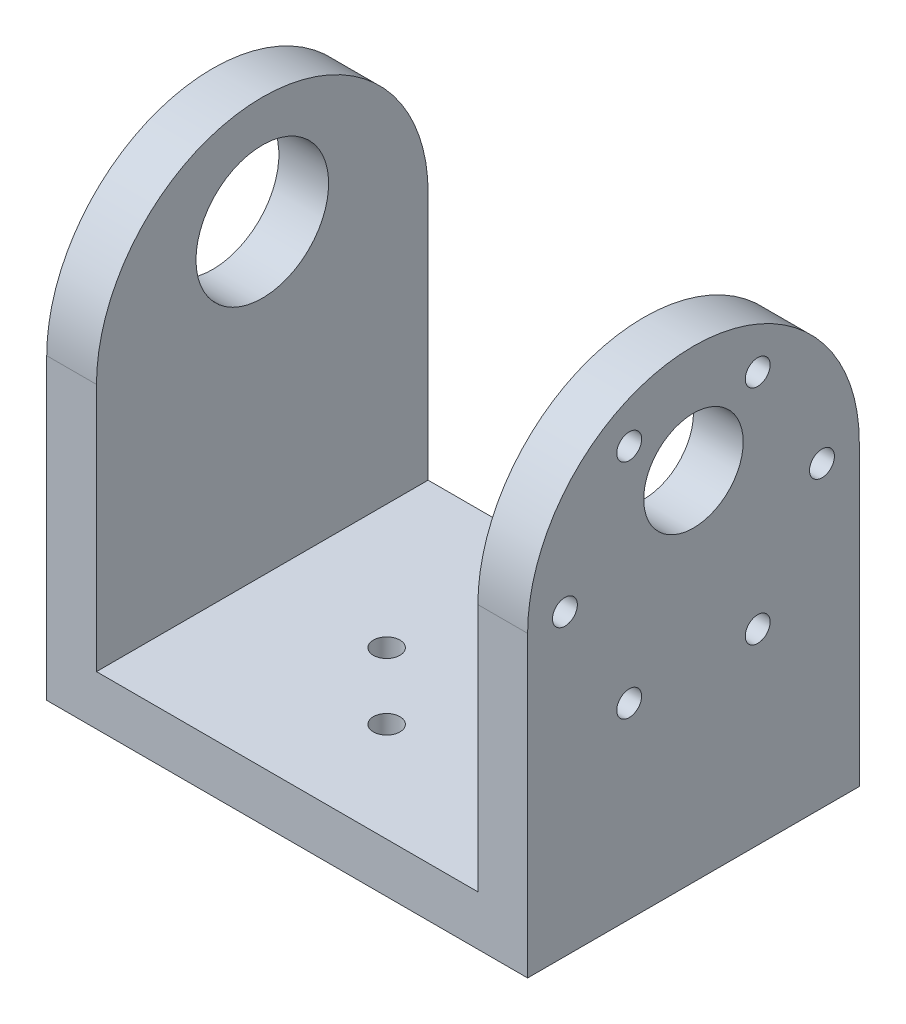
ISO-10303-21;
HEADER;
FILE_DESCRIPTION(('STEP AP214'),'2;1');
FILE_NAME('part.step','',(''),(''),'','','');
FILE_SCHEMA(('AUTOMOTIVE_DESIGN { 1 0 10303 214 1 1 1 1 }'));
ENDSEC;
DATA;
#1=APPLICATION_CONTEXT('core data for automotive mechanical design processes');
#2=APPLICATION_PROTOCOL_DEFINITION('international standard','automotive_design',2000,#1);
#3=PRODUCT_CONTEXT('',#1,'mechanical');
#4=PRODUCT('Part','Part','',(#3));
#5=PRODUCT_RELATED_PRODUCT_CATEGORY('part','',(#4));
#6=PRODUCT_DEFINITION_FORMATION('','',#4);
#7=PRODUCT_DEFINITION_CONTEXT('part definition',#1,'design');
#8=PRODUCT_DEFINITION('design','',#6,#7);
#9=PRODUCT_DEFINITION_SHAPE('','',#8);
#10=(LENGTH_UNIT() NAMED_UNIT(*) SI_UNIT(.MILLI.,.METRE.));
#11=(NAMED_UNIT(*) PLANE_ANGLE_UNIT() SI_UNIT($,.RADIAN.));
#12=(NAMED_UNIT(*) SI_UNIT($,.STERADIAN.) SOLID_ANGLE_UNIT());
#13=UNCERTAINTY_MEASURE_WITH_UNIT(LENGTH_MEASURE(1.E-05),#10,'distance_accuracy_value','');
#14=(GEOMETRIC_REPRESENTATION_CONTEXT(3) GLOBAL_UNCERTAINTY_ASSIGNED_CONTEXT((#13)) GLOBAL_UNIT_ASSIGNED_CONTEXT((#10,
#11,#12)) REPRESENTATION_CONTEXT('',''));
#15=CARTESIAN_POINT('',(0.,0.,0.));
#16=DIRECTION('',(0.,0.,1.));
#17=DIRECTION('',(1.,0.,0.));
#18=AXIS2_PLACEMENT_3D('',#15,#16,#17);
#19=CARTESIAN_POINT('',(0.,2.,0.));
#20=DIRECTION('',(0.,1.,0.));
#21=DIRECTION('',(0.,0.,1.));
#22=AXIS2_PLACEMENT_3D('',#19,#20,#21);
#23=PLANE('',#22);
#24=CARTESIAN_POINT('',(11.5,2.,-11.1985294117647));
#25=DIRECTION('',(0.,1.,0.));
#26=DIRECTION('',(0.,0.,1.));
#27=AXIS2_PLACEMENT_3D('',#24,#25,#26);
#28=CIRCLE('',#27,1.6);
#29=CARTESIAN_POINT('',(11.5,2.,-9.59852941176471));
#30=VERTEX_POINT('',#29);
#31=EDGE_CURVE('E336',#30,#30,#28,.T.);
#32=ORIENTED_EDGE('',*,*,#31,.F.);
#33=EDGE_LOOP('',(#32));
#34=FACE_BOUND('',#33,.T.);
#35=CARTESIAN_POINT('',(3.50000000000008,2.,-3.19852941176471));
#36=DIRECTION('',(0.,1.,0.));
#37=DIRECTION('',(0.,0.,1.));
#38=AXIS2_PLACEMENT_3D('',#35,#36,#37);
#39=CIRCLE('',#38,1.6);
#40=CARTESIAN_POINT('',(3.50000000000008,2.,-1.59852941176471));
#41=VERTEX_POINT('',#40);
#42=EDGE_CURVE('E343',#41,#41,#39,.T.);
#43=ORIENTED_EDGE('',*,*,#42,.F.);
#44=EDGE_LOOP('',(#43));
#45=FACE_BOUND('',#44,.T.);
#46=CARTESIAN_POINT('',(-4.50000000000001,2.,-11.1985294117647));
#47=DIRECTION('',(0.,1.,0.));
#48=DIRECTION('',(0.,0.,1.));
#49=AXIS2_PLACEMENT_3D('',#46,#47,#48);
#50=CIRCLE('',#49,1.6);
#51=CARTESIAN_POINT('',(-4.50000000000001,2.,-9.59852941176465));
#52=VERTEX_POINT('',#51);
#53=EDGE_CURVE('E347',#52,#52,#50,.T.);
#54=ORIENTED_EDGE('',*,*,#53,.F.);
#55=EDGE_LOOP('',(#54));
#56=FACE_BOUND('',#55,.T.);
#57=CARTESIAN_POINT('',(3.49999999999997,2.,-19.1985294117647));
#58=DIRECTION('',(0.,1.,0.));
#59=DIRECTION('',(0.,0.,1.));
#60=AXIS2_PLACEMENT_3D('',#57,#58,#59);
#61=CIRCLE('',#60,1.6);
#62=CARTESIAN_POINT('',(3.49999999999997,2.,-17.5985294117647));
#63=VERTEX_POINT('',#62);
#64=EDGE_CURVE('E351',#63,#63,#61,.T.);
#65=ORIENTED_EDGE('',*,*,#64,.F.);
#66=EDGE_LOOP('',(#65));
#67=FACE_BOUND('',#66,.T.);
#68=DIRECTION('',(1.,0.,0.));
#69=VECTOR('',#68,1.);
#70=CARTESIAN_POINT('',(-21.5,2.,8.80147058823529));
#71=LINE('',#70,#69);
#72=CARTESIAN_POINT('',(-19.5,2.,8.80147058823529));
#73=VERTEX_POINT('',#72);
#74=CARTESIAN_POINT('',(26.5,2.,8.80147058823529));
#75=VERTEX_POINT('',#74);
#76=EDGE_CURVE('E65',#73,#75,#71,.T.);
#77=ORIENTED_EDGE('',*,*,#76,.T.);
#78=DIRECTION('',(0.,0.,-1.));
#79=VECTOR('',#78,1.);
#80=CARTESIAN_POINT('',(26.5,2.,0.));
#81=LINE('',#80,#79);
#82=CARTESIAN_POINT('',(26.5,2.,-31.1985294117647));
#83=VERTEX_POINT('',#82);
#84=EDGE_CURVE('E69',#75,#83,#81,.T.);
#85=ORIENTED_EDGE('',*,*,#84,.T.);
#86=DIRECTION('',(-1.,0.,0.));
#87=VECTOR('',#86,1.);
#88=CARTESIAN_POINT('',(-21.5,2.,-31.1985294117647));
#89=LINE('',#88,#87);
#90=CARTESIAN_POINT('',(-19.5,2.,-31.1985294117647));
#91=VERTEX_POINT('',#90);
#92=EDGE_CURVE('E194',#83,#91,#89,.T.);
#93=ORIENTED_EDGE('',*,*,#92,.T.);
#94=DIRECTION('',(0.,0.,1.));
#95=VECTOR('',#94,1.);
#96=CARTESIAN_POINT('',(-19.5,2.,8.80147058823529));
#97=LINE('',#96,#95);
#98=EDGE_CURVE('E124',#91,#73,#97,.T.);
#99=ORIENTED_EDGE('',*,*,#98,.T.);
#100=EDGE_LOOP('',(#77,#85,#93,#99));
#101=FACE_BOUND('',#100,.T.);
#102=ADVANCED_FACE('F47',(#34,#45,#56,#67,#101),#23,.T.);
#103=CARTESIAN_POINT('',(-21.5,-4.,8.80147058823529));
#104=DIRECTION('',(0.,0.,1.));
#105=DIRECTION('',(1.,0.,0.));
#106=AXIS2_PLACEMENT_3D('',#103,#104,#105);
#107=PLANE('',#106);
#108=DIRECTION('',(1.,0.,0.));
#109=VECTOR('',#108,1.);
#110=CARTESIAN_POINT('',(-21.5,-4.,8.80147058823529));
#111=LINE('',#110,#109);
#112=CARTESIAN_POINT('',(-25.5,-4.,8.80147058823529));
#113=VERTEX_POINT('',#112);
#114=CARTESIAN_POINT('',(32.5,-4.,8.80147058823529));
#115=VERTEX_POINT('',#114);
#116=EDGE_CURVE('E11',#113,#115,#111,.T.);
#117=ORIENTED_EDGE('',*,*,#116,.T.);
#118=DIRECTION('',(0.,-1.,0.));
#119=VECTOR('',#118,1.);
#120=CARTESIAN_POINT('',(32.5,-4.,8.80147058823529));
#121=LINE('',#120,#119);
#122=CARTESIAN_POINT('',(32.5,32.,8.80147058823529));
#123=VERTEX_POINT('',#122);
#124=EDGE_CURVE('E144',#123,#115,#121,.T.);
#125=ORIENTED_EDGE('',*,*,#124,.F.);
#126=DIRECTION('',(-1.,0.,0.));
#127=VECTOR('',#126,1.);
#128=CARTESIAN_POINT('',(32.5,32.,8.80147058823529));
#129=LINE('',#128,#127);
#130=CARTESIAN_POINT('',(26.5,32.,8.80147058823529));
#131=VERTEX_POINT('',#130);
#132=EDGE_CURVE('E163',#123,#131,#129,.T.);
#133=ORIENTED_EDGE('',*,*,#132,.T.);
#134=DIRECTION('',(0.,-1.,0.));
#135=VECTOR('',#134,1.);
#136=CARTESIAN_POINT('',(26.5,-4.,8.80147058823529));
#137=LINE('',#136,#135);
#138=EDGE_CURVE('E278',#131,#75,#137,.T.);
#139=ORIENTED_EDGE('',*,*,#138,.T.);
#140=ORIENTED_EDGE('',*,*,#76,.F.);
#141=DIRECTION('',(0.,1.,0.));
#142=VECTOR('',#141,1.);
#143=CARTESIAN_POINT('',(-19.5,2.,8.80147058823529));
#144=LINE('',#143,#142);
#145=CARTESIAN_POINT('',(-19.5,32.,8.80147058823529));
#146=VERTEX_POINT('',#145);
#147=EDGE_CURVE('E172',#73,#146,#144,.T.);
#148=ORIENTED_EDGE('',*,*,#147,.T.);
#149=DIRECTION('',(1.,0.,0.));
#150=VECTOR('',#149,1.);
#151=CARTESIAN_POINT('',(-25.5,32.,8.80147058823529));
#152=LINE('',#151,#150);
#153=CARTESIAN_POINT('',(-25.5,32.,8.80147058823529));
#154=VERTEX_POINT('',#153);
#155=EDGE_CURVE('E120',#154,#146,#152,.T.);
#156=ORIENTED_EDGE('',*,*,#155,.F.);
#157=DIRECTION('',(0.,1.,0.));
#158=VECTOR('',#157,1.);
#159=CARTESIAN_POINT('',(-25.5,2.,8.80147058823529));
#160=LINE('',#159,#158);
#161=EDGE_CURVE('E113',#113,#154,#160,.T.);
#162=ORIENTED_EDGE('',*,*,#161,.F.);
#163=EDGE_LOOP('',(#117,#125,#133,#139,#140,#148,#156,#162));
#164=FACE_BOUND('',#163,.T.);
#165=ADVANCED_FACE('F115',(#164),#107,.T.);
#166=CARTESIAN_POINT('',(-21.5,-4.,-31.1985294117647));
#167=DIRECTION('',(0.,0.,-1.));
#168=DIRECTION('',(-1.,0.,0.));
#169=AXIS2_PLACEMENT_3D('',#166,#167,#168);
#170=PLANE('',#169);
#171=DIRECTION('',(0.,-1.,0.));
#172=VECTOR('',#171,1.);
#173=CARTESIAN_POINT('',(-19.5,2.,-31.1985294117647));
#174=LINE('',#173,#172);
#175=CARTESIAN_POINT('',(-19.5,32.,-31.1985294117647));
#176=VERTEX_POINT('',#175);
#177=EDGE_CURVE('E179',#176,#91,#174,.T.);
#178=ORIENTED_EDGE('',*,*,#177,.T.);
#179=ORIENTED_EDGE('',*,*,#92,.F.);
#180=DIRECTION('',(0.,1.,0.));
#181=VECTOR('',#180,1.);
#182=CARTESIAN_POINT('',(26.5,-4.,-31.1985294117647));
#183=LINE('',#182,#181);
#184=CARTESIAN_POINT('',(26.5,32.,-31.1985294117647));
#185=VERTEX_POINT('',#184);
#186=EDGE_CURVE('E155',#83,#185,#183,.T.);
#187=ORIENTED_EDGE('',*,*,#186,.T.);
#188=DIRECTION('',(-1.,0.,0.));
#189=VECTOR('',#188,1.);
#190=CARTESIAN_POINT('',(32.5,32.,-31.1985294117647));
#191=LINE('',#190,#189);
#192=CARTESIAN_POINT('',(32.5,32.,-31.1985294117647));
#193=VERTEX_POINT('',#192);
#194=EDGE_CURVE('E166',#193,#185,#191,.T.);
#195=ORIENTED_EDGE('',*,*,#194,.F.);
#196=DIRECTION('',(0.,1.,0.));
#197=VECTOR('',#196,1.);
#198=CARTESIAN_POINT('',(32.5,-4.,-31.1985294117647));
#199=LINE('',#198,#197);
#200=CARTESIAN_POINT('',(32.5,-4.,-31.1985294117647));
#201=VERTEX_POINT('',#200);
#202=EDGE_CURVE('E143',#201,#193,#199,.T.);
#203=ORIENTED_EDGE('',*,*,#202,.F.);
#204=DIRECTION('',(-1.,0.,0.));
#205=VECTOR('',#204,1.);
#206=CARTESIAN_POINT('',(-21.5,-4.,-31.1985294117647));
#207=LINE('',#206,#205);
#208=CARTESIAN_POINT('',(-25.5,-4.,-31.1985294117647));
#209=VERTEX_POINT('',#208);
#210=EDGE_CURVE('E57',#201,#209,#207,.T.);
#211=ORIENTED_EDGE('',*,*,#210,.T.);
#212=DIRECTION('',(0.,-1.,0.));
#213=VECTOR('',#212,1.);
#214=CARTESIAN_POINT('',(-25.5,2.,-31.1985294117647));
#215=LINE('',#214,#213);
#216=CARTESIAN_POINT('',(-25.5,32.,-31.1985294117647));
#217=VERTEX_POINT('',#216);
#218=EDGE_CURVE('E131',#217,#209,#215,.T.);
#219=ORIENTED_EDGE('',*,*,#218,.F.);
#220=DIRECTION('',(1.,0.,0.));
#221=VECTOR('',#220,1.);
#222=CARTESIAN_POINT('',(-25.5,32.,-31.1985294117647));
#223=LINE('',#222,#221);
#224=EDGE_CURVE('E189',#217,#176,#223,.T.);
#225=ORIENTED_EDGE('',*,*,#224,.T.);
#226=EDGE_LOOP('',(#178,#179,#187,#195,#203,#211,#219,#225));
#227=FACE_BOUND('',#226,.T.);
#228=ADVANCED_FACE('F49',(#227),#170,.T.);
#229=CARTESIAN_POINT('',(0.,-4.,0.));
#230=DIRECTION('',(0.,1.,0.));
#231=DIRECTION('',(0.,0.,1.));
#232=AXIS2_PLACEMENT_3D('',#229,#230,#231);
#233=PLANE('',#232);
#234=CARTESIAN_POINT('',(11.5,-4.,-11.1985294117647));
#235=DIRECTION('',(0.,-1.,0.));
#236=DIRECTION('',(0.,0.,-1.));
#237=AXIS2_PLACEMENT_3D('',#234,#235,#236);
#238=CIRCLE('',#237,1.6);
#239=CARTESIAN_POINT('',(11.5,-4.,-12.7985294117647));
#240=VERTEX_POINT('',#239);
#241=EDGE_CURVE('E355',#240,#240,#238,.T.);
#242=ORIENTED_EDGE('',*,*,#241,.F.);
#243=EDGE_LOOP('',(#242));
#244=FACE_BOUND('',#243,.T.);
#245=CARTESIAN_POINT('',(3.50000000000008,-4.,-3.19852941176471));
#246=DIRECTION('',(0.,-1.,0.));
#247=DIRECTION('',(0.,0.,-1.));
#248=AXIS2_PLACEMENT_3D('',#245,#246,#247);
#249=CIRCLE('',#248,1.6);
#250=CARTESIAN_POINT('',(3.50000000000008,-4.,-4.79852941176471));
#251=VERTEX_POINT('',#250);
#252=EDGE_CURVE('E364',#251,#251,#249,.T.);
#253=ORIENTED_EDGE('',*,*,#252,.F.);
#254=EDGE_LOOP('',(#253));
#255=FACE_BOUND('',#254,.T.);
#256=CARTESIAN_POINT('',(-4.50000000000001,-4.,-11.1985294117647));
#257=DIRECTION('',(0.,-1.,0.));
#258=DIRECTION('',(0.,0.,-1.));
#259=AXIS2_PLACEMENT_3D('',#256,#257,#258);
#260=CIRCLE('',#259,1.6);
#261=CARTESIAN_POINT('',(-4.50000000000001,-4.,-12.7985294117647));
#262=VERTEX_POINT('',#261);
#263=EDGE_CURVE('E360',#262,#262,#260,.T.);
#264=ORIENTED_EDGE('',*,*,#263,.F.);
#265=EDGE_LOOP('',(#264));
#266=FACE_BOUND('',#265,.T.);
#267=CARTESIAN_POINT('',(3.49999999999997,-4.,-19.1985294117647));
#268=DIRECTION('',(0.,-1.,0.));
#269=DIRECTION('',(0.,0.,-1.));
#270=AXIS2_PLACEMENT_3D('',#267,#268,#269);
#271=CIRCLE('',#270,1.6);
#272=CARTESIAN_POINT('',(3.49999999999997,-4.,-20.7985294117647));
#273=VERTEX_POINT('',#272);
#274=EDGE_CURVE('E356',#273,#273,#271,.T.);
#275=ORIENTED_EDGE('',*,*,#274,.F.);
#276=EDGE_LOOP('',(#275));
#277=FACE_BOUND('',#276,.T.);
#278=DIRECTION('',(0.,0.,-1.));
#279=VECTOR('',#278,1.);
#280=CARTESIAN_POINT('',(-25.5,-4.,0.));
#281=LINE('',#280,#279);
#282=EDGE_CURVE('E128',#113,#209,#281,.T.);
#283=ORIENTED_EDGE('',*,*,#282,.T.);
#284=ORIENTED_EDGE('',*,*,#210,.F.);
#285=DIRECTION('',(0.,0.,-1.));
#286=VECTOR('',#285,1.);
#287=CARTESIAN_POINT('',(32.5,-4.,8.80147058823529));
#288=LINE('',#287,#286);
#289=EDGE_CURVE('E138',#115,#201,#288,.T.);
#290=ORIENTED_EDGE('',*,*,#289,.F.);
#291=ORIENTED_EDGE('',*,*,#116,.F.);
#292=EDGE_LOOP('',(#283,#284,#290,#291));
#293=FACE_BOUND('',#292,.T.);
#294=ADVANCED_FACE('F136',(#244,#255,#266,#277,#293),#233,.F.);
#295=CARTESIAN_POINT('',(-25.5,32.,-11.1985294117647));
#296=DIRECTION('',(1.,0.,0.));
#297=DIRECTION('',(0.,0.,-1.));
#298=AXIS2_PLACEMENT_3D('',#295,#296,#297);
#299=CYLINDRICAL_SURFACE('',#298,20.);
#300=ORIENTED_EDGE('',*,*,#155,.T.);
#301=CARTESIAN_POINT('',(-19.5,32.,-11.1985294117647));
#302=DIRECTION('',(-1.,0.,0.));
#303=DIRECTION('',(0.,0.,1.));
#304=AXIS2_PLACEMENT_3D('',#301,#302,#303);
#305=CIRCLE('',#304,20.);
#306=EDGE_CURVE('E175',#146,#176,#305,.T.);
#307=ORIENTED_EDGE('',*,*,#306,.T.);
#308=ORIENTED_EDGE('',*,*,#224,.F.);
#309=CARTESIAN_POINT('',(-25.5,32.,-11.1985294117647));
#310=DIRECTION('',(-1.,0.,0.));
#311=DIRECTION('',(0.,0.,1.));
#312=AXIS2_PLACEMENT_3D('',#309,#310,#311);
#313=CIRCLE('',#312,20.);
#314=EDGE_CURVE('E123',#154,#217,#313,.T.);
#315=ORIENTED_EDGE('',*,*,#314,.F.);
#316=EDGE_LOOP('',(#300,#307,#308,#315));
#317=FACE_BOUND('',#316,.T.);
#318=ADVANCED_FACE('F376',(#317),#299,.T.);
#319=CARTESIAN_POINT('',(-25.5,32.,-11.1985294117647));
#320=DIRECTION('',(-1.,0.,0.));
#321=DIRECTION('',(0.,0.,1.));
#322=AXIS2_PLACEMENT_3D('',#319,#320,#321);
#323=PLANE('',#322);
#324=CARTESIAN_POINT('',(-25.5,39.,-11.1985294117647));
#325=DIRECTION('',(-1.,0.,0.));
#326=DIRECTION('',(0.,0.,1.));
#327=AXIS2_PLACEMENT_3D('',#324,#325,#326);
#328=CIRCLE('',#327,8.);
#329=CARTESIAN_POINT('',(-25.5,39.,-3.19852941176471));
#330=VERTEX_POINT('',#329);
#331=EDGE_CURVE('E332',#330,#330,#328,.T.);
#332=ORIENTED_EDGE('',*,*,#331,.F.);
#333=EDGE_LOOP('',(#332));
#334=FACE_BOUND('',#333,.T.);
#335=ORIENTED_EDGE('',*,*,#161,.T.);
#336=ORIENTED_EDGE('',*,*,#314,.T.);
#337=ORIENTED_EDGE('',*,*,#218,.T.);
#338=ORIENTED_EDGE('',*,*,#282,.F.);
#339=EDGE_LOOP('',(#335,#336,#337,#338));
#340=FACE_BOUND('',#339,.T.);
#341=ADVANCED_FACE('F129',(#334,#340),#323,.T.);
#342=CARTESIAN_POINT('',(-19.5,32.,-11.1985294117647));
#343=DIRECTION('',(-1.,0.,0.));
#344=DIRECTION('',(0.,0.,1.));
#345=AXIS2_PLACEMENT_3D('',#342,#343,#344);
#346=PLANE('',#345);
#347=CARTESIAN_POINT('',(-19.5,39.,-11.1985294117647));
#348=DIRECTION('',(-1.,0.,0.));
#349=DIRECTION('',(0.,0.,1.));
#350=AXIS2_PLACEMENT_3D('',#347,#348,#349);
#351=CIRCLE('',#350,8.);
#352=CARTESIAN_POINT('',(-19.5,39.,-3.19852941176471));
#353=VERTEX_POINT('',#352);
#354=EDGE_CURVE('E328',#353,#353,#351,.T.);
#355=ORIENTED_EDGE('',*,*,#354,.T.);
#356=EDGE_LOOP('',(#355));
#357=FACE_BOUND('',#356,.T.);
#358=ORIENTED_EDGE('',*,*,#147,.F.);
#359=ORIENTED_EDGE('',*,*,#98,.F.);
#360=ORIENTED_EDGE('',*,*,#177,.F.);
#361=ORIENTED_EDGE('',*,*,#306,.F.);
#362=EDGE_LOOP('',(#358,#359,#360,#361));
#363=FACE_BOUND('',#362,.T.);
#364=ADVANCED_FACE('F415',(#357,#363),#346,.F.);
#365=CARTESIAN_POINT('',(32.5,32.,-11.1985294117647));
#366=DIRECTION('',(-1.,0.,0.));
#367=DIRECTION('',(0.,0.,1.));
#368=AXIS2_PLACEMENT_3D('',#365,#366,#367);
#369=CYLINDRICAL_SURFACE('',#368,20.);
#370=ORIENTED_EDGE('',*,*,#194,.T.);
#371=CARTESIAN_POINT('',(26.5,32.,-11.1985294117647));
#372=DIRECTION('',(1.,0.,0.));
#373=DIRECTION('',(0.,0.,-1.));
#374=AXIS2_PLACEMENT_3D('',#371,#372,#373);
#375=CIRCLE('',#374,20.);
#376=EDGE_CURVE('E151',#185,#131,#375,.T.);
#377=ORIENTED_EDGE('',*,*,#376,.T.);
#378=ORIENTED_EDGE('',*,*,#132,.F.);
#379=CARTESIAN_POINT('',(32.5,32.,-11.1985294117647));
#380=DIRECTION('',(1.,0.,0.));
#381=DIRECTION('',(0.,0.,-1.));
#382=AXIS2_PLACEMENT_3D('',#379,#380,#381);
#383=CIRCLE('',#382,20.);
#384=EDGE_CURVE('E148',#193,#123,#383,.T.);
#385=ORIENTED_EDGE('',*,*,#384,.F.);
#386=EDGE_LOOP('',(#370,#377,#378,#385));
#387=FACE_BOUND('',#386,.T.);
#388=ADVANCED_FACE('F419',(#387),#369,.T.);
#389=CARTESIAN_POINT('',(32.5,32.,-11.1985294117647));
#390=DIRECTION('',(1.,0.,0.));
#391=DIRECTION('',(0.,0.,-1.));
#392=AXIS2_PLACEMENT_3D('',#389,#390,#391);
#393=PLANE('',#392);
#394=CARTESIAN_POINT('',(32.5,32.,4.30147058823529));
#395=DIRECTION('',(1.,0.,0.));
#396=DIRECTION('',(0.,0.,-1.));
#397=AXIS2_PLACEMENT_3D('',#394,#395,#396);
#398=CIRCLE('',#397,1.5);
#399=CARTESIAN_POINT('',(32.5,32.,2.80147058823529));
#400=VERTEX_POINT('',#399);
#401=EDGE_CURVE('E280',#400,#400,#398,.F.);
#402=ORIENTED_EDGE('',*,*,#401,.T.);
#403=EDGE_LOOP('',(#402));
#404=FACE_BOUND('',#403,.T.);
#405=CARTESIAN_POINT('',(32.5,39.,-11.1985294117647));
#406=DIRECTION('',(1.,0.,0.));
#407=DIRECTION('',(0.,0.,-1.));
#408=AXIS2_PLACEMENT_3D('',#405,#406,#407);
#409=CIRCLE('',#408,6.);
#410=CARTESIAN_POINT('',(32.5,39.,-17.1985294117647));
#411=VERTEX_POINT('',#410);
#412=EDGE_CURVE('E205',#411,#411,#409,.F.);
#413=ORIENTED_EDGE('',*,*,#412,.T.);
#414=EDGE_LOOP('',(#413));
#415=FACE_BOUND('',#414,.T.);
#416=CARTESIAN_POINT('',(32.5,45.4233937586587,-3.44852941176455));
#417=DIRECTION('',(1.,0.,0.));
#418=DIRECTION('',(0.,0.,-1.));
#419=AXIS2_PLACEMENT_3D('',#416,#417,#418);
#420=CIRCLE('',#419,1.5);
#421=CARTESIAN_POINT('',(32.5,45.4233937586587,-4.94852941176455));
#422=VERTEX_POINT('',#421);
#423=EDGE_CURVE('E206',#422,#422,#420,.F.);
#424=ORIENTED_EDGE('',*,*,#423,.T.);
#425=EDGE_LOOP('',(#424));
#426=FACE_BOUND('',#425,.T.);
#427=CARTESIAN_POINT('',(32.5,45.4233937586589,-18.9485294117646));
#428=DIRECTION('',(1.,0.,0.));
#429=DIRECTION('',(0.,0.,-1.));
#430=AXIS2_PLACEMENT_3D('',#427,#428,#429);
#431=CIRCLE('',#430,1.5);
#432=CARTESIAN_POINT('',(32.5,45.4233937586589,-20.4485294117646));
#433=VERTEX_POINT('',#432);
#434=EDGE_CURVE('E293',#433,#433,#431,.F.);
#435=ORIENTED_EDGE('',*,*,#434,.T.);
#436=EDGE_LOOP('',(#435));
#437=FACE_BOUND('',#436,.T.);
#438=CARTESIAN_POINT('',(32.5,32.0000000000001,-26.6985294117647));
#439=DIRECTION('',(1.,0.,0.));
#440=DIRECTION('',(0.,0.,-1.));
#441=AXIS2_PLACEMENT_3D('',#438,#439,#440);
#442=CIRCLE('',#441,1.5);
#443=CARTESIAN_POINT('',(32.5,32.0000000000001,-28.1985294117647));
#444=VERTEX_POINT('',#443);
#445=EDGE_CURVE('E297',#444,#444,#442,.F.);
#446=ORIENTED_EDGE('',*,*,#445,.T.);
#447=EDGE_LOOP('',(#446));
#448=FACE_BOUND('',#447,.T.);
#449=CARTESIAN_POINT('',(32.5,18.5766062413412,-18.9485294117648));
#450=DIRECTION('',(1.,0.,0.));
#451=DIRECTION('',(0.,0.,-1.));
#452=AXIS2_PLACEMENT_3D('',#449,#450,#451);
#453=CIRCLE('',#452,1.5);
#454=CARTESIAN_POINT('',(32.5,18.5766062413412,-20.4485294117648));
#455=VERTEX_POINT('',#454);
#456=EDGE_CURVE('E301',#455,#455,#453,.F.);
#457=ORIENTED_EDGE('',*,*,#456,.T.);
#458=EDGE_LOOP('',(#457));
#459=FACE_BOUND('',#458,.T.);
#460=CARTESIAN_POINT('',(32.5,18.5766062413412,-3.44852941176474));
#461=DIRECTION('',(1.,0.,0.));
#462=DIRECTION('',(0.,0.,-1.));
#463=AXIS2_PLACEMENT_3D('',#460,#461,#462);
#464=CIRCLE('',#463,1.5);
#465=CARTESIAN_POINT('',(32.5,18.5766062413412,-4.94852941176474));
#466=VERTEX_POINT('',#465);
#467=EDGE_CURVE('E134',#466,#466,#464,.F.);
#468=ORIENTED_EDGE('',*,*,#467,.T.);
#469=EDGE_LOOP('',(#468));
#470=FACE_BOUND('',#469,.T.);
#471=ORIENTED_EDGE('',*,*,#124,.T.);
#472=ORIENTED_EDGE('',*,*,#289,.T.);
#473=ORIENTED_EDGE('',*,*,#202,.T.);
#474=ORIENTED_EDGE('',*,*,#384,.T.);
#475=EDGE_LOOP('',(#471,#472,#473,#474));
#476=FACE_BOUND('',#475,.T.);
#477=ADVANCED_FACE('F146',(#404,#415,#426,#437,#448,#459,#470,#476),#393,.T.);
#478=CARTESIAN_POINT('',(26.5,32.,-11.1985294117647));
#479=DIRECTION('',(1.,0.,0.));
#480=DIRECTION('',(0.,0.,-1.));
#481=AXIS2_PLACEMENT_3D('',#478,#479,#480);
#482=PLANE('',#481);
#483=CARTESIAN_POINT('',(26.5,32.,4.30147058823529));
#484=DIRECTION('',(1.,0.,0.));
#485=DIRECTION('',(0.,0.,-1.));
#486=AXIS2_PLACEMENT_3D('',#483,#484,#485);
#487=CIRCLE('',#486,2.39573471274262);
#488=CARTESIAN_POINT('',(26.5,32.,1.90573587549268));
#489=VERTEX_POINT('',#488);
#490=EDGE_CURVE('E51',#489,#489,#487,.F.);
#491=ORIENTED_EDGE('',*,*,#490,.F.);
#492=EDGE_LOOP('',(#491));
#493=FACE_BOUND('',#492,.T.);
#494=CARTESIAN_POINT('',(26.5,18.5766062413413,-3.44852941176455));
#495=DIRECTION('',(1.,0.,0.));
#496=DIRECTION('',(0.,0.,-1.));
#497=AXIS2_PLACEMENT_3D('',#494,#495,#496);
#498=CIRCLE('',#497,2.39573471274262);
#499=CARTESIAN_POINT('',(26.5,18.5766062413413,-5.84426412450716));
#500=VERTEX_POINT('',#499);
#501=EDGE_CURVE('E247',#500,#500,#498,.F.);
#502=ORIENTED_EDGE('',*,*,#501,.F.);
#503=EDGE_LOOP('',(#502));
#504=FACE_BOUND('',#503,.T.);
#505=CARTESIAN_POINT('',(26.5,18.5766062413411,-18.9485294117646));
#506=DIRECTION('',(1.,0.,0.));
#507=DIRECTION('',(0.,0.,-1.));
#508=AXIS2_PLACEMENT_3D('',#505,#506,#507);
#509=CIRCLE('',#508,2.39573471274262);
#510=CARTESIAN_POINT('',(26.5,18.5766062413411,-21.3442641245072));
#511=VERTEX_POINT('',#510);
#512=EDGE_CURVE('E244',#511,#511,#509,.F.);
#513=ORIENTED_EDGE('',*,*,#512,.F.);
#514=EDGE_LOOP('',(#513));
#515=FACE_BOUND('',#514,.T.);
#516=CARTESIAN_POINT('',(26.5,31.9999999999999,-26.6985294117647));
#517=DIRECTION('',(1.,0.,0.));
#518=DIRECTION('',(0.,0.,-1.));
#519=AXIS2_PLACEMENT_3D('',#516,#517,#518);
#520=CIRCLE('',#519,2.39573471274262);
#521=CARTESIAN_POINT('',(26.5,31.9999999999999,-29.0942641245073));
#522=VERTEX_POINT('',#521);
#523=EDGE_CURVE('E240',#522,#522,#520,.F.);
#524=ORIENTED_EDGE('',*,*,#523,.F.);
#525=EDGE_LOOP('',(#524));
#526=FACE_BOUND('',#525,.T.);
#527=CARTESIAN_POINT('',(26.5,45.4233937586588,-18.9485294117648));
#528=DIRECTION('',(1.,0.,0.));
#529=DIRECTION('',(0.,0.,-1.));
#530=AXIS2_PLACEMENT_3D('',#527,#528,#529);
#531=CIRCLE('',#530,2.39573471274261);
#532=CARTESIAN_POINT('',(26.5,45.4233937586588,-21.3442641245074));
#533=VERTEX_POINT('',#532);
#534=EDGE_CURVE('E236',#533,#533,#531,.F.);
#535=ORIENTED_EDGE('',*,*,#534,.F.);
#536=EDGE_LOOP('',(#535));
#537=FACE_BOUND('',#536,.T.);
#538=CARTESIAN_POINT('',(26.5,45.4233937586588,-3.44852941176474));
#539=DIRECTION('',(1.,0.,0.));
#540=DIRECTION('',(0.,0.,-1.));
#541=AXIS2_PLACEMENT_3D('',#538,#539,#540);
#542=CIRCLE('',#541,2.39573471274262);
#543=CARTESIAN_POINT('',(26.5,45.4233937586588,-5.84426412450736));
#544=VERTEX_POINT('',#543);
#545=EDGE_CURVE('E232',#544,#544,#542,.F.);
#546=ORIENTED_EDGE('',*,*,#545,.F.);
#547=EDGE_LOOP('',(#546));
#548=FACE_BOUND('',#547,.T.);
#549=CARTESIAN_POINT('',(26.5,39.,-11.1985294117647));
#550=DIRECTION('',(1.,0.,0.));
#551=DIRECTION('',(0.,0.,-1.));
#552=AXIS2_PLACEMENT_3D('',#549,#550,#551);
#553=CIRCLE('',#552,6.);
#554=CARTESIAN_POINT('',(26.5,39.,-17.1985294117647));
#555=VERTEX_POINT('',#554);
#556=EDGE_CURVE('E201',#555,#555,#553,.F.);
#557=ORIENTED_EDGE('',*,*,#556,.F.);
#558=EDGE_LOOP('',(#557));
#559=FACE_BOUND('',#558,.T.);
#560=ORIENTED_EDGE('',*,*,#84,.F.);
#561=ORIENTED_EDGE('',*,*,#138,.F.);
#562=ORIENTED_EDGE('',*,*,#376,.F.);
#563=ORIENTED_EDGE('',*,*,#186,.F.);
#564=EDGE_LOOP('',(#560,#561,#562,#563));
#565=FACE_BOUND('',#564,.T.);
#566=ADVANCED_FACE('F258',(#493,#504,#515,#526,#537,#548,#559,#565),#482,.F.);
#567=CARTESIAN_POINT('',(-31.5,18.5766062413412,-3.44852941176474));
#568=DIRECTION('',(1.,0.,0.));
#569=DIRECTION('',(0.,0.,-1.));
#570=AXIS2_PLACEMENT_3D('',#567,#568,#569);
#571=CYLINDRICAL_SURFACE('',#570,1.5);
#572=CARTESIAN_POINT('',(28.5,18.5766062413412,-3.44852941176474));
#573=DIRECTION('',(1.,0.,0.));
#574=DIRECTION('',(0.,0.,-1.));
#575=AXIS2_PLACEMENT_3D('',#572,#573,#574);
#576=CIRCLE('',#575,1.5);
#577=CARTESIAN_POINT('',(28.5,18.5766062413412,-4.94852941176474));
#578=VERTEX_POINT('',#577);
#579=EDGE_CURVE('E228',#578,#578,#576,.T.);
#580=ORIENTED_EDGE('',*,*,#579,.F.);
#581=EDGE_LOOP('',(#580));
#582=FACE_BOUND('',#581,.T.);
#583=ORIENTED_EDGE('',*,*,#467,.F.);
#584=EDGE_LOOP('',(#583));
#585=FACE_BOUND('',#584,.T.);
#586=ADVANCED_FACE('F261',(#582,#585),#571,.F.);
#587=CARTESIAN_POINT('',(-31.5,18.5766062413412,-18.9485294117648));
#588=DIRECTION('',(1.,0.,0.));
#589=DIRECTION('',(0.,0.,-1.));
#590=AXIS2_PLACEMENT_3D('',#587,#588,#589);
#591=CYLINDRICAL_SURFACE('',#590,1.5);
#592=CARTESIAN_POINT('',(28.5,18.5766062413412,-18.9485294117648));
#593=DIRECTION('',(1.,0.,0.));
#594=DIRECTION('',(0.,0.,-1.));
#595=AXIS2_PLACEMENT_3D('',#592,#593,#594);
#596=CIRCLE('',#595,1.5);
#597=CARTESIAN_POINT('',(28.5,18.5766062413412,-20.4485294117648));
#598=VERTEX_POINT('',#597);
#599=EDGE_CURVE('E224',#598,#598,#596,.T.);
#600=ORIENTED_EDGE('',*,*,#599,.F.);
#601=EDGE_LOOP('',(#600));
#602=FACE_BOUND('',#601,.T.);
#603=ORIENTED_EDGE('',*,*,#456,.F.);
#604=EDGE_LOOP('',(#603));
#605=FACE_BOUND('',#604,.T.);
#606=ADVANCED_FACE('F435',(#602,#605),#591,.F.);
#607=CARTESIAN_POINT('',(-31.5,32.0000000000001,-26.6985294117647));
#608=DIRECTION('',(1.,0.,0.));
#609=DIRECTION('',(0.,0.,-1.));
#610=AXIS2_PLACEMENT_3D('',#607,#608,#609);
#611=CYLINDRICAL_SURFACE('',#610,1.5);
#612=CARTESIAN_POINT('',(28.5,32.0000000000001,-26.6985294117647));
#613=DIRECTION('',(1.,0.,0.));
#614=DIRECTION('',(0.,0.,-1.));
#615=AXIS2_PLACEMENT_3D('',#612,#613,#614);
#616=CIRCLE('',#615,1.5);
#617=CARTESIAN_POINT('',(28.5,32.0000000000001,-28.1985294117647));
#618=VERTEX_POINT('',#617);
#619=EDGE_CURVE('E220',#618,#618,#616,.T.);
#620=ORIENTED_EDGE('',*,*,#619,.F.);
#621=EDGE_LOOP('',(#620));
#622=FACE_BOUND('',#621,.T.);
#623=ORIENTED_EDGE('',*,*,#445,.F.);
#624=EDGE_LOOP('',(#623));
#625=FACE_BOUND('',#624,.T.);
#626=ADVANCED_FACE('F431',(#622,#625),#611,.F.);
#627=CARTESIAN_POINT('',(-31.5,45.4233937586589,-18.9485294117646));
#628=DIRECTION('',(1.,0.,0.));
#629=DIRECTION('',(0.,0.,-1.));
#630=AXIS2_PLACEMENT_3D('',#627,#628,#629);
#631=CYLINDRICAL_SURFACE('',#630,1.5);
#632=CARTESIAN_POINT('',(28.5,45.4233937586589,-18.9485294117646));
#633=DIRECTION('',(1.,0.,0.));
#634=DIRECTION('',(0.,0.,-1.));
#635=AXIS2_PLACEMENT_3D('',#632,#633,#634);
#636=CIRCLE('',#635,1.5);
#637=CARTESIAN_POINT('',(28.5,45.4233937586589,-20.4485294117646));
#638=VERTEX_POINT('',#637);
#639=EDGE_CURVE('E216',#638,#638,#636,.T.);
#640=ORIENTED_EDGE('',*,*,#639,.F.);
#641=EDGE_LOOP('',(#640));
#642=FACE_BOUND('',#641,.T.);
#643=ORIENTED_EDGE('',*,*,#434,.F.);
#644=EDGE_LOOP('',(#643));
#645=FACE_BOUND('',#644,.T.);
#646=ADVANCED_FACE('F427',(#642,#645),#631,.F.);
#647=CARTESIAN_POINT('',(-31.5,45.4233937586587,-3.44852941176455));
#648=DIRECTION('',(1.,0.,0.));
#649=DIRECTION('',(0.,0.,-1.));
#650=AXIS2_PLACEMENT_3D('',#647,#648,#649);
#651=CYLINDRICAL_SURFACE('',#650,1.5);
#652=CARTESIAN_POINT('',(28.5,45.4233937586587,-3.44852941176455));
#653=DIRECTION('',(1.,0.,0.));
#654=DIRECTION('',(0.,0.,-1.));
#655=AXIS2_PLACEMENT_3D('',#652,#653,#654);
#656=CIRCLE('',#655,1.5);
#657=CARTESIAN_POINT('',(28.5,45.4233937586587,-4.94852941176455));
#658=VERTEX_POINT('',#657);
#659=EDGE_CURVE('E211',#658,#658,#656,.T.);
#660=ORIENTED_EDGE('',*,*,#659,.F.);
#661=EDGE_LOOP('',(#660));
#662=FACE_BOUND('',#661,.T.);
#663=ORIENTED_EDGE('',*,*,#423,.F.);
#664=EDGE_LOOP('',(#663));
#665=FACE_BOUND('',#664,.T.);
#666=ADVANCED_FACE('F430',(#662,#665),#651,.F.);
#667=CARTESIAN_POINT('',(-31.5,39.,-11.1985294117647));
#668=DIRECTION('',(1.,0.,0.));
#669=DIRECTION('',(0.,0.,-1.));
#670=AXIS2_PLACEMENT_3D('',#667,#668,#669);
#671=CYLINDRICAL_SURFACE('',#670,6.);
#672=ORIENTED_EDGE('',*,*,#412,.F.);
#673=EDGE_LOOP('',(#672));
#674=FACE_BOUND('',#673,.T.);
#675=ORIENTED_EDGE('',*,*,#556,.T.);
#676=EDGE_LOOP('',(#675));
#677=FACE_BOUND('',#676,.T.);
#678=ADVANCED_FACE('F443',(#674,#677),#671,.F.);
#679=CARTESIAN_POINT('',(-31.5,32.,4.30147058823529));
#680=DIRECTION('',(1.,0.,0.));
#681=DIRECTION('',(0.,0.,-1.));
#682=AXIS2_PLACEMENT_3D('',#679,#680,#681);
#683=CYLINDRICAL_SURFACE('',#682,1.5);
#684=CARTESIAN_POINT('',(28.5,32.,4.30147058823529));
#685=DIRECTION('',(1.,0.,0.));
#686=DIRECTION('',(0.,0.,-1.));
#687=AXIS2_PLACEMENT_3D('',#684,#685,#686);
#688=CIRCLE('',#687,1.5);
#689=CARTESIAN_POINT('',(28.5,32.,2.80147058823529));
#690=VERTEX_POINT('',#689);
#691=EDGE_CURVE('E207',#690,#690,#688,.T.);
#692=ORIENTED_EDGE('',*,*,#691,.F.);
#693=EDGE_LOOP('',(#692));
#694=FACE_BOUND('',#693,.T.);
#695=ORIENTED_EDGE('',*,*,#401,.F.);
#696=EDGE_LOOP('',(#695));
#697=FACE_BOUND('',#696,.T.);
#698=ADVANCED_FACE('F446',(#694,#697),#683,.F.);
#699=CARTESIAN_POINT('',(28.5,32.,4.30147058823529));
#700=DIRECTION('',(-1.,0.,0.));
#701=DIRECTION('',(0.,0.,1.));
#702=AXIS2_PLACEMENT_3D('',#699,#700,#701);
#703=CYLINDRICAL_SURFACE('',#702,2.39573471274262);
#704=CARTESIAN_POINT('',(28.5,32.,4.30147058823529));
#705=DIRECTION('',(1.,0.,0.));
#706=DIRECTION('',(0.,0.,-1.));
#707=AXIS2_PLACEMENT_3D('',#704,#705,#706);
#708=CIRCLE('',#707,2.39573471274262);
#709=CARTESIAN_POINT('',(28.5,32.,1.90573587549268));
#710=VERTEX_POINT('',#709);
#711=EDGE_CURVE('E212',#710,#710,#708,.T.);
#712=ORIENTED_EDGE('',*,*,#711,.T.);
#713=EDGE_LOOP('',(#712));
#714=FACE_BOUND('',#713,.T.);
#715=ORIENTED_EDGE('',*,*,#490,.T.);
#716=EDGE_LOOP('',(#715));
#717=FACE_BOUND('',#716,.T.);
#718=ADVANCED_FACE('F256',(#714,#717),#703,.F.);
#719=CARTESIAN_POINT('',(28.5,32.,4.30147058823529));
#720=DIRECTION('',(1.,0.,0.));
#721=DIRECTION('',(0.,0.,-1.));
#722=AXIS2_PLACEMENT_3D('',#719,#720,#721);
#723=PLANE('',#722);
#724=ORIENTED_EDGE('',*,*,#691,.T.);
#725=EDGE_LOOP('',(#724));
#726=FACE_BOUND('',#725,.T.);
#727=ORIENTED_EDGE('',*,*,#711,.F.);
#728=EDGE_LOOP('',(#727));
#729=FACE_BOUND('',#728,.T.);
#730=ADVANCED_FACE('F486',(#726,#729),#723,.F.);
#731=CARTESIAN_POINT('',(28.5,45.4233937586588,-3.44852941176474));
#732=DIRECTION('',(-1.,0.,0.));
#733=DIRECTION('',(0.,0.,1.));
#734=AXIS2_PLACEMENT_3D('',#731,#732,#733);
#735=CYLINDRICAL_SURFACE('',#734,2.39573471274262);
#736=CARTESIAN_POINT('',(28.5,45.4233937586588,-3.44852941176474));
#737=DIRECTION('',(1.,0.,0.));
#738=DIRECTION('',(0.,0.,-1.));
#739=AXIS2_PLACEMENT_3D('',#736,#737,#738);
#740=CIRCLE('',#739,2.39573471274262);
#741=CARTESIAN_POINT('',(28.5,45.4233937586588,-5.84426412450736));
#742=VERTEX_POINT('',#741);
#743=EDGE_CURVE('E321',#742,#742,#740,.T.);
#744=ORIENTED_EDGE('',*,*,#743,.T.);
#745=EDGE_LOOP('',(#744));
#746=FACE_BOUND('',#745,.T.);
#747=ORIENTED_EDGE('',*,*,#545,.T.);
#748=EDGE_LOOP('',(#747));
#749=FACE_BOUND('',#748,.T.);
#750=ADVANCED_FACE('F482',(#746,#749),#735,.F.);
#751=CARTESIAN_POINT('',(28.5,45.4233937586588,-3.44852941176474));
#752=DIRECTION('',(1.,0.,0.));
#753=DIRECTION('',(0.,0.,-1.));
#754=AXIS2_PLACEMENT_3D('',#751,#752,#753);
#755=PLANE('',#754);
#756=ORIENTED_EDGE('',*,*,#659,.T.);
#757=EDGE_LOOP('',(#756));
#758=FACE_BOUND('',#757,.T.);
#759=ORIENTED_EDGE('',*,*,#743,.F.);
#760=EDGE_LOOP('',(#759));
#761=FACE_BOUND('',#760,.T.);
#762=ADVANCED_FACE('F478',(#758,#761),#755,.F.);
#763=CARTESIAN_POINT('',(28.5,45.4233937586588,-18.9485294117648));
#764=DIRECTION('',(-1.,0.,0.));
#765=DIRECTION('',(0.,0.,1.));
#766=AXIS2_PLACEMENT_3D('',#763,#764,#765);
#767=CYLINDRICAL_SURFACE('',#766,2.39573471274261);
#768=CARTESIAN_POINT('',(28.5,45.4233937586588,-18.9485294117648));
#769=DIRECTION('',(1.,0.,0.));
#770=DIRECTION('',(0.,0.,-1.));
#771=AXIS2_PLACEMENT_3D('',#768,#769,#770);
#772=CIRCLE('',#771,2.39573471274261);
#773=CARTESIAN_POINT('',(28.5,45.4233937586588,-21.3442641245074));
#774=VERTEX_POINT('',#773);
#775=EDGE_CURVE('E317',#774,#774,#772,.T.);
#776=ORIENTED_EDGE('',*,*,#775,.T.);
#777=EDGE_LOOP('',(#776));
#778=FACE_BOUND('',#777,.T.);
#779=ORIENTED_EDGE('',*,*,#534,.T.);
#780=EDGE_LOOP('',(#779));
#781=FACE_BOUND('',#780,.T.);
#782=ADVANCED_FACE('F474',(#778,#781),#767,.F.);
#783=CARTESIAN_POINT('',(28.5,45.4233937586588,-18.9485294117648));
#784=DIRECTION('',(1.,0.,0.));
#785=DIRECTION('',(0.,0.,-1.));
#786=AXIS2_PLACEMENT_3D('',#783,#784,#785);
#787=PLANE('',#786);
#788=ORIENTED_EDGE('',*,*,#639,.T.);
#789=EDGE_LOOP('',(#788));
#790=FACE_BOUND('',#789,.T.);
#791=ORIENTED_EDGE('',*,*,#775,.F.);
#792=EDGE_LOOP('',(#791));
#793=FACE_BOUND('',#792,.T.);
#794=ADVANCED_FACE('F470',(#790,#793),#787,.F.);
#795=CARTESIAN_POINT('',(28.5,31.9999999999999,-26.6985294117647));
#796=DIRECTION('',(-1.,0.,0.));
#797=DIRECTION('',(0.,0.,1.));
#798=AXIS2_PLACEMENT_3D('',#795,#796,#797);
#799=CYLINDRICAL_SURFACE('',#798,2.39573471274262);
#800=CARTESIAN_POINT('',(28.5,31.9999999999999,-26.6985294117647));
#801=DIRECTION('',(1.,0.,0.));
#802=DIRECTION('',(0.,0.,-1.));
#803=AXIS2_PLACEMENT_3D('',#800,#801,#802);
#804=CIRCLE('',#803,2.39573471274262);
#805=CARTESIAN_POINT('',(28.5,31.9999999999999,-29.0942641245073));
#806=VERTEX_POINT('',#805);
#807=EDGE_CURVE('E312',#806,#806,#804,.T.);
#808=ORIENTED_EDGE('',*,*,#807,.T.);
#809=EDGE_LOOP('',(#808));
#810=FACE_BOUND('',#809,.T.);
#811=ORIENTED_EDGE('',*,*,#523,.T.);
#812=EDGE_LOOP('',(#811));
#813=FACE_BOUND('',#812,.T.);
#814=ADVANCED_FACE('F466',(#810,#813),#799,.F.);
#815=CARTESIAN_POINT('',(28.5,31.9999999999999,-26.6985294117647));
#816=DIRECTION('',(1.,0.,0.));
#817=DIRECTION('',(0.,0.,-1.));
#818=AXIS2_PLACEMENT_3D('',#815,#816,#817);
#819=PLANE('',#818);
#820=ORIENTED_EDGE('',*,*,#619,.T.);
#821=EDGE_LOOP('',(#820));
#822=FACE_BOUND('',#821,.T.);
#823=ORIENTED_EDGE('',*,*,#807,.F.);
#824=EDGE_LOOP('',(#823));
#825=FACE_BOUND('',#824,.T.);
#826=ADVANCED_FACE('F462',(#822,#825),#819,.F.);
#827=CARTESIAN_POINT('',(28.5,18.5766062413411,-18.9485294117646));
#828=DIRECTION('',(-1.,0.,0.));
#829=DIRECTION('',(0.,0.,1.));
#830=AXIS2_PLACEMENT_3D('',#827,#828,#829);
#831=CYLINDRICAL_SURFACE('',#830,2.39573471274262);
#832=CARTESIAN_POINT('',(28.5,18.5766062413411,-18.9485294117646));
#833=DIRECTION('',(1.,0.,0.));
#834=DIRECTION('',(0.,0.,-1.));
#835=AXIS2_PLACEMENT_3D('',#832,#833,#834);
#836=CIRCLE('',#835,2.39573471274262);
#837=CARTESIAN_POINT('',(28.5,18.5766062413411,-21.3442641245072));
#838=VERTEX_POINT('',#837);
#839=EDGE_CURVE('E308',#838,#838,#836,.T.);
#840=ORIENTED_EDGE('',*,*,#839,.T.);
#841=EDGE_LOOP('',(#840));
#842=FACE_BOUND('',#841,.T.);
#843=ORIENTED_EDGE('',*,*,#512,.T.);
#844=EDGE_LOOP('',(#843));
#845=FACE_BOUND('',#844,.T.);
#846=ADVANCED_FACE('F458',(#842,#845),#831,.F.);
#847=CARTESIAN_POINT('',(28.5,18.5766062413411,-18.9485294117646));
#848=DIRECTION('',(1.,0.,0.));
#849=DIRECTION('',(0.,0.,-1.));
#850=AXIS2_PLACEMENT_3D('',#847,#848,#849);
#851=PLANE('',#850);
#852=ORIENTED_EDGE('',*,*,#599,.T.);
#853=EDGE_LOOP('',(#852));
#854=FACE_BOUND('',#853,.T.);
#855=ORIENTED_EDGE('',*,*,#839,.F.);
#856=EDGE_LOOP('',(#855));
#857=FACE_BOUND('',#856,.T.);
#858=ADVANCED_FACE('F454',(#854,#857),#851,.F.);
#859=CARTESIAN_POINT('',(28.5,18.5766062413413,-3.44852941176455));
#860=DIRECTION('',(-1.,0.,0.));
#861=DIRECTION('',(0.,0.,1.));
#862=AXIS2_PLACEMENT_3D('',#859,#860,#861);
#863=CYLINDRICAL_SURFACE('',#862,2.39573471274262);
#864=CARTESIAN_POINT('',(28.5,18.5766062413413,-3.44852941176455));
#865=DIRECTION('',(1.,0.,0.));
#866=DIRECTION('',(0.,0.,-1.));
#867=AXIS2_PLACEMENT_3D('',#864,#865,#866);
#868=CIRCLE('',#867,2.39573471274262);
#869=CARTESIAN_POINT('',(28.5,18.5766062413413,-5.84426412450716));
#870=VERTEX_POINT('',#869);
#871=EDGE_CURVE('E313',#870,#870,#868,.T.);
#872=ORIENTED_EDGE('',*,*,#871,.T.);
#873=EDGE_LOOP('',(#872));
#874=FACE_BOUND('',#873,.T.);
#875=ORIENTED_EDGE('',*,*,#501,.T.);
#876=EDGE_LOOP('',(#875));
#877=FACE_BOUND('',#876,.T.);
#878=ADVANCED_FACE('F457',(#874,#877),#863,.F.);
#879=CARTESIAN_POINT('',(28.5,18.5766062413413,-3.44852941176455));
#880=DIRECTION('',(1.,0.,0.));
#881=DIRECTION('',(0.,0.,-1.));
#882=AXIS2_PLACEMENT_3D('',#879,#880,#881);
#883=PLANE('',#882);
#884=ORIENTED_EDGE('',*,*,#579,.T.);
#885=EDGE_LOOP('',(#884));
#886=FACE_BOUND('',#885,.T.);
#887=ORIENTED_EDGE('',*,*,#871,.F.);
#888=EDGE_LOOP('',(#887));
#889=FACE_BOUND('',#888,.T.);
#890=ADVANCED_FACE('F397',(#886,#889),#883,.F.);
#891=CARTESIAN_POINT('',(-19.5,39.,-11.1985294117647));
#892=DIRECTION('',(-1.,0.,0.));
#893=DIRECTION('',(0.,0.,1.));
#894=AXIS2_PLACEMENT_3D('',#891,#892,#893);
#895=CYLINDRICAL_SURFACE('',#894,8.);
#896=ORIENTED_EDGE('',*,*,#354,.F.);
#897=EDGE_LOOP('',(#896));
#898=FACE_BOUND('',#897,.T.);
#899=ORIENTED_EDGE('',*,*,#331,.T.);
#900=EDGE_LOOP('',(#899));
#901=FACE_BOUND('',#900,.T.);
#902=ADVANCED_FACE('F387',(#898,#901),#895,.F.);
#903=CARTESIAN_POINT('',(3.49999999999997,6.,-19.1985294117647));
#904=DIRECTION('',(0.,-1.,0.));
#905=DIRECTION('',(0.,0.,-1.));
#906=AXIS2_PLACEMENT_3D('',#903,#904,#905);
#907=CYLINDRICAL_SURFACE('',#906,1.6);
#908=ORIENTED_EDGE('',*,*,#64,.T.);
#909=EDGE_LOOP('',(#908));
#910=FACE_BOUND('',#909,.T.);
#911=ORIENTED_EDGE('',*,*,#274,.T.);
#912=EDGE_LOOP('',(#911));
#913=FACE_BOUND('',#912,.T.);
#914=ADVANCED_FACE('F384',(#910,#913),#907,.F.);
#915=CARTESIAN_POINT('',(-4.50000000000001,6.,-11.1985294117647));
#916=DIRECTION('',(0.,-1.,0.));
#917=DIRECTION('',(0.,0.,-1.));
#918=AXIS2_PLACEMENT_3D('',#915,#916,#917);
#919=CYLINDRICAL_SURFACE('',#918,1.6);
#920=ORIENTED_EDGE('',*,*,#53,.T.);
#921=EDGE_LOOP('',(#920));
#922=FACE_BOUND('',#921,.T.);
#923=ORIENTED_EDGE('',*,*,#263,.T.);
#924=EDGE_LOOP('',(#923));
#925=FACE_BOUND('',#924,.T.);
#926=ADVANCED_FACE('F386',(#922,#925),#919,.F.);
#927=CARTESIAN_POINT('',(3.50000000000008,6.,-3.19852941176471));
#928=DIRECTION('',(0.,-1.,0.));
#929=DIRECTION('',(0.,0.,-1.));
#930=AXIS2_PLACEMENT_3D('',#927,#928,#929);
#931=CYLINDRICAL_SURFACE('',#930,1.6);
#932=ORIENTED_EDGE('',*,*,#42,.T.);
#933=EDGE_LOOP('',(#932));
#934=FACE_BOUND('',#933,.T.);
#935=ORIENTED_EDGE('',*,*,#252,.T.);
#936=EDGE_LOOP('',(#935));
#937=FACE_BOUND('',#936,.T.);
#938=ADVANCED_FACE('F394',(#934,#937),#931,.F.);
#939=CARTESIAN_POINT('',(11.5,6.,-11.1985294117647));
#940=DIRECTION('',(0.,-1.,0.));
#941=DIRECTION('',(0.,0.,-1.));
#942=AXIS2_PLACEMENT_3D('',#939,#940,#941);
#943=CYLINDRICAL_SURFACE('',#942,1.6);
#944=ORIENTED_EDGE('',*,*,#31,.T.);
#945=EDGE_LOOP('',(#944));
#946=FACE_BOUND('',#945,.T.);
#947=ORIENTED_EDGE('',*,*,#241,.T.);
#948=EDGE_LOOP('',(#947));
#949=FACE_BOUND('',#948,.T.);
#950=ADVANCED_FACE('F372',(#946,#949),#943,.F.);
#951=CLOSED_SHELL('',(#102,#165,#228,#294,#318,#341,#364,#388,#477,#566,#586,#606,#626,#646,
#666,#678,#698,#718,#730,#750,#762,#782,#794,#814,#826,#846,#858,#878,#890,#902,#914,#926,#938,#950));
#952=MANIFOLD_SOLID_BREP('B2',#951);
#953=ADVANCED_BREP_SHAPE_REPRESENTATION('',(#18,#952),#14);
#954=SHAPE_DEFINITION_REPRESENTATION(#9,#953);
ENDSEC;
END-ISO-10303-21;
